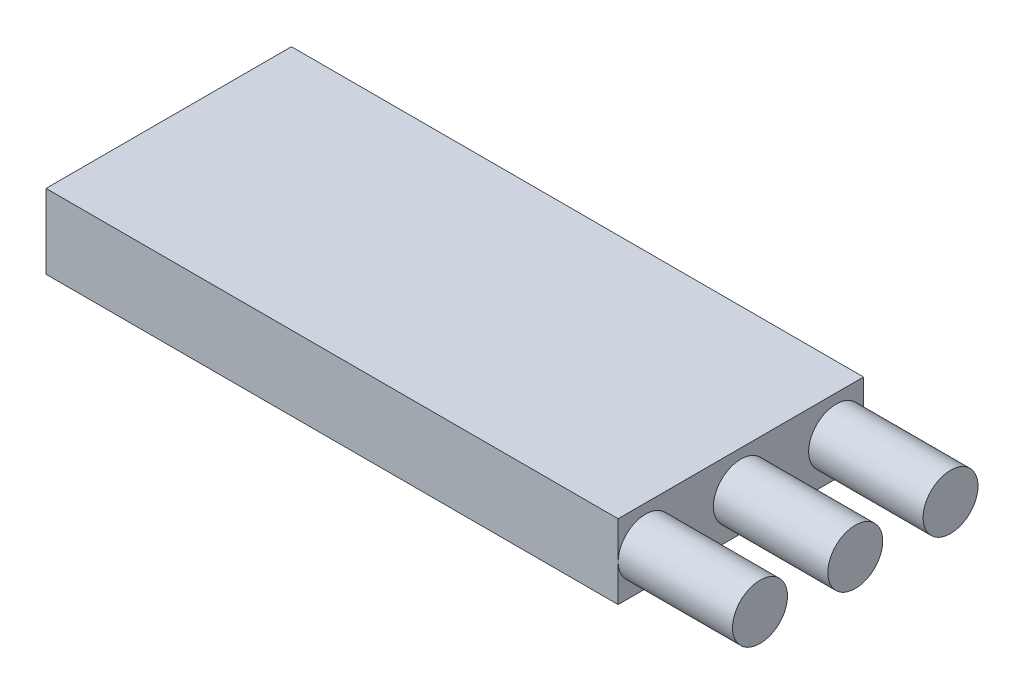
ISO-10303-21;
HEADER;
FILE_DESCRIPTION(('STEP AP214'),'2;1');
FILE_NAME('part.step','',(''),(''),'','','');
FILE_SCHEMA(('AUTOMOTIVE_DESIGN { 1 0 10303 214 1 1 1 1 }'));
ENDSEC;
DATA;
#1=APPLICATION_CONTEXT('core data for automotive mechanical design processes');
#2=APPLICATION_PROTOCOL_DEFINITION('international standard','automotive_design',2000,#1);
#3=PRODUCT_CONTEXT('',#1,'mechanical');
#4=PRODUCT('Part','Part','',(#3));
#5=PRODUCT_RELATED_PRODUCT_CATEGORY('part','',(#4));
#6=PRODUCT_DEFINITION_FORMATION('','',#4);
#7=PRODUCT_DEFINITION_CONTEXT('part definition',#1,'design');
#8=PRODUCT_DEFINITION('design','',#6,#7);
#9=PRODUCT_DEFINITION_SHAPE('','',#8);
#10=(LENGTH_UNIT() NAMED_UNIT(*) SI_UNIT(.MILLI.,.METRE.));
#11=(NAMED_UNIT(*) PLANE_ANGLE_UNIT() SI_UNIT($,.RADIAN.));
#12=(NAMED_UNIT(*) SI_UNIT($,.STERADIAN.) SOLID_ANGLE_UNIT());
#13=UNCERTAINTY_MEASURE_WITH_UNIT(LENGTH_MEASURE(1.E-05),#10,'distance_accuracy_value','');
#14=(GEOMETRIC_REPRESENTATION_CONTEXT(3) GLOBAL_UNCERTAINTY_ASSIGNED_CONTEXT((#13)) GLOBAL_UNIT_ASSIGNED_CONTEXT((#10,
#11,#12)) REPRESENTATION_CONTEXT('',''));
#15=CARTESIAN_POINT('',(0.,0.,0.));
#16=DIRECTION('',(0.,0.,1.));
#17=DIRECTION('',(1.,0.,0.));
#18=AXIS2_PLACEMENT_3D('',#15,#16,#17);
#19=CARTESIAN_POINT('',(0.,6.5,0.));
#20=DIRECTION('',(1.,0.,0.));
#21=DIRECTION('',(0.,0.,-1.));
#22=AXIS2_PLACEMENT_3D('',#19,#20,#21);
#23=PLANE('',#22);
#24=DIRECTION('',(0.,0.,1.));
#25=VECTOR('',#24,1.);
#26=CARTESIAN_POINT('',(0.,0.,0.));
#27=LINE('',#26,#25);
#28=CARTESIAN_POINT('',(0.,0.,-21.45));
#29=VERTEX_POINT('',#28);
#30=CARTESIAN_POINT('',(0.,0.,0.));
#31=VERTEX_POINT('',#30);
#32=EDGE_CURVE('E116',#29,#31,#27,.T.);
#33=ORIENTED_EDGE('',*,*,#32,.T.);
#34=DIRECTION('',(0.,-1.,0.));
#35=VECTOR('',#34,1.);
#36=CARTESIAN_POINT('',(0.,6.5,0.));
#37=LINE('',#36,#35);
#38=CARTESIAN_POINT('',(0.,6.5,0.));
#39=VERTEX_POINT('',#38);
#40=EDGE_CURVE('E39',#39,#31,#37,.T.);
#41=ORIENTED_EDGE('',*,*,#40,.F.);
#42=DIRECTION('',(0.,0.,1.));
#43=VECTOR('',#42,1.);
#44=CARTESIAN_POINT('',(0.,6.5,0.));
#45=LINE('',#44,#43);
#46=CARTESIAN_POINT('',(0.,6.5,-21.45));
#47=VERTEX_POINT('',#46);
#48=EDGE_CURVE('E120',#47,#39,#45,.T.);
#49=ORIENTED_EDGE('',*,*,#48,.F.);
#50=DIRECTION('',(0.,-1.,0.));
#51=VECTOR('',#50,1.);
#52=CARTESIAN_POINT('',(0.,6.5,-21.45));
#53=LINE('',#52,#51);
#54=EDGE_CURVE('E101',#47,#29,#53,.T.);
#55=ORIENTED_EDGE('',*,*,#54,.T.);
#56=EDGE_LOOP('',(#33,#41,#49,#55));
#57=FACE_BOUND('',#56,.T.);
#58=ADVANCED_FACE('F36',(#57),#23,.F.);
#59=CARTESIAN_POINT('',(0.,6.5,0.));
#60=DIRECTION('',(0.,0.,-1.));
#61=DIRECTION('',(-1.,0.,0.));
#62=AXIS2_PLACEMENT_3D('',#59,#60,#61);
#63=PLANE('',#62);
#64=DIRECTION('',(1.,0.,0.));
#65=VECTOR('',#64,1.);
#66=CARTESIAN_POINT('',(0.,0.,0.));
#67=LINE('',#66,#65);
#68=CARTESIAN_POINT('',(50.,0.,0.));
#69=VERTEX_POINT('',#68);
#70=EDGE_CURVE('E110',#31,#69,#67,.T.);
#71=ORIENTED_EDGE('',*,*,#70,.T.);
#72=DIRECTION('',(0.,-1.,0.));
#73=VECTOR('',#72,1.);
#74=CARTESIAN_POINT('',(50.,6.5,0.));
#75=LINE('',#74,#73);
#76=CARTESIAN_POINT('',(50.,3.25,0.));
#77=VERTEX_POINT('',#76);
#78=EDGE_CURVE('E94',#77,#69,#75,.T.);
#79=ORIENTED_EDGE('',*,*,#78,.F.);
#80=CARTESIAN_POINT('',(50.,6.5,0.));
#81=VERTEX_POINT('',#80);
#82=EDGE_CURVE('E104',#81,#77,#75,.T.);
#83=ORIENTED_EDGE('',*,*,#82,.F.);
#84=DIRECTION('',(1.,0.,0.));
#85=VECTOR('',#84,1.);
#86=CARTESIAN_POINT('',(0.,6.5,0.));
#87=LINE('',#86,#85);
#88=EDGE_CURVE('E83',#39,#81,#87,.T.);
#89=ORIENTED_EDGE('',*,*,#88,.F.);
#90=ORIENTED_EDGE('',*,*,#40,.T.);
#91=EDGE_LOOP('',(#71,#79,#83,#89,#90));
#92=FACE_BOUND('',#91,.T.);
#93=ADVANCED_FACE('F111',(#92),#63,.F.);
#94=CARTESIAN_POINT('',(50.,6.5,0.));
#95=DIRECTION('',(-1.,0.,0.));
#96=DIRECTION('',(0.,0.,1.));
#97=AXIS2_PLACEMENT_3D('',#94,#95,#96);
#98=PLANE('',#97);
#99=CARTESIAN_POINT('',(50.,3.25,-10.725));
#100=DIRECTION('',(1.,0.,0.));
#101=DIRECTION('',(0.,0.,-1.));
#102=AXIS2_PLACEMENT_3D('',#99,#100,#101);
#103=CIRCLE('',#102,2.4);
#104=CARTESIAN_POINT('',(50.,3.25,-13.125));
#105=VERTEX_POINT('',#104);
#106=EDGE_CURVE('E11',#105,#105,#103,.T.);
#107=ORIENTED_EDGE('',*,*,#106,.F.);
#108=EDGE_LOOP('',(#107));
#109=FACE_BOUND('',#108,.T.);
#110=DIRECTION('',(0.,-1.,0.));
#111=VECTOR('',#110,1.);
#112=CARTESIAN_POINT('',(50.,6.5,-21.45));
#113=LINE('',#112,#111);
#114=CARTESIAN_POINT('',(50.,3.25,-21.45));
#115=VERTEX_POINT('',#114);
#116=CARTESIAN_POINT('',(50.,0.,-21.45));
#117=VERTEX_POINT('',#116);
#118=EDGE_CURVE('E71',#115,#117,#113,.T.);
#119=ORIENTED_EDGE('',*,*,#118,.F.);
#120=CARTESIAN_POINT('',(50.,3.25,-19.05));
#121=DIRECTION('',(1.,0.,0.));
#122=DIRECTION('',(0.,0.,-1.));
#123=AXIS2_PLACEMENT_3D('',#120,#121,#122);
#124=CIRCLE('',#123,2.4);
#125=EDGE_CURVE('E98',#115,#115,#124,.T.);
#126=ORIENTED_EDGE('',*,*,#125,.F.);
#127=CARTESIAN_POINT('',(50.,6.5,-21.45));
#128=VERTEX_POINT('',#127);
#129=EDGE_CURVE('E89',#128,#115,#113,.T.);
#130=ORIENTED_EDGE('',*,*,#129,.F.);
#131=DIRECTION('',(0.,0.,-1.));
#132=VECTOR('',#131,1.);
#133=CARTESIAN_POINT('',(50.,6.5,0.));
#134=LINE('',#133,#132);
#135=EDGE_CURVE('E125',#81,#128,#134,.T.);
#136=ORIENTED_EDGE('',*,*,#135,.F.);
#137=ORIENTED_EDGE('',*,*,#82,.T.);
#138=CARTESIAN_POINT('',(50.,3.25,-2.4));
#139=DIRECTION('',(1.,0.,0.));
#140=DIRECTION('',(0.,0.,-1.));
#141=AXIS2_PLACEMENT_3D('',#138,#139,#140);
#142=CIRCLE('',#141,2.4);
#143=EDGE_CURVE('E109',#77,#77,#142,.T.);
#144=ORIENTED_EDGE('',*,*,#143,.F.);
#145=ORIENTED_EDGE('',*,*,#78,.T.);
#146=DIRECTION('',(0.,0.,-1.));
#147=VECTOR('',#146,1.);
#148=CARTESIAN_POINT('',(50.,0.,0.));
#149=LINE('',#148,#147);
#150=EDGE_CURVE('E100',#69,#117,#149,.T.);
#151=ORIENTED_EDGE('',*,*,#150,.T.);
#152=EDGE_LOOP('',(#119,#126,#130,#136,#137,#144,#145,#151));
#153=FACE_BOUND('',#152,.T.);
#154=ADVANCED_FACE('F96',(#109,#153),#98,.F.);
#155=CARTESIAN_POINT('',(0.,6.5,-21.45));
#156=DIRECTION('',(0.,0.,1.));
#157=DIRECTION('',(1.,0.,0.));
#158=AXIS2_PLACEMENT_3D('',#155,#156,#157);
#159=PLANE('',#158);
#160=DIRECTION('',(-1.,0.,0.));
#161=VECTOR('',#160,1.);
#162=CARTESIAN_POINT('',(0.,0.,-21.45));
#163=LINE('',#162,#161);
#164=EDGE_CURVE('E75',#117,#29,#163,.T.);
#165=ORIENTED_EDGE('',*,*,#164,.T.);
#166=ORIENTED_EDGE('',*,*,#54,.F.);
#167=DIRECTION('',(-1.,0.,0.));
#168=VECTOR('',#167,1.);
#169=CARTESIAN_POINT('',(0.,6.5,-21.45));
#170=LINE('',#169,#168);
#171=EDGE_CURVE('E53',#128,#47,#170,.T.);
#172=ORIENTED_EDGE('',*,*,#171,.F.);
#173=ORIENTED_EDGE('',*,*,#129,.T.);
#174=ORIENTED_EDGE('',*,*,#118,.T.);
#175=EDGE_LOOP('',(#165,#166,#172,#173,#174));
#176=FACE_BOUND('',#175,.T.);
#177=ADVANCED_FACE('F90',(#176),#159,.F.);
#178=CARTESIAN_POINT('',(0.,6.5,0.));
#179=DIRECTION('',(0.,-1.,0.));
#180=DIRECTION('',(0.,0.,-1.));
#181=AXIS2_PLACEMENT_3D('',#178,#179,#180);
#182=PLANE('',#181);
#183=ORIENTED_EDGE('',*,*,#48,.T.);
#184=ORIENTED_EDGE('',*,*,#88,.T.);
#185=ORIENTED_EDGE('',*,*,#135,.T.);
#186=ORIENTED_EDGE('',*,*,#171,.T.);
#187=EDGE_LOOP('',(#183,#184,#185,#186));
#188=FACE_BOUND('',#187,.T.);
#189=ADVANCED_FACE('F161',(#188),#182,.F.);
#190=CARTESIAN_POINT('',(0.,0.,0.));
#191=DIRECTION('',(0.,-1.,0.));
#192=DIRECTION('',(0.,0.,-1.));
#193=AXIS2_PLACEMENT_3D('',#190,#191,#192);
#194=PLANE('',#193);
#195=ORIENTED_EDGE('',*,*,#32,.F.);
#196=ORIENTED_EDGE('',*,*,#164,.F.);
#197=ORIENTED_EDGE('',*,*,#150,.F.);
#198=ORIENTED_EDGE('',*,*,#70,.F.);
#199=EDGE_LOOP('',(#195,#196,#197,#198));
#200=FACE_BOUND('',#199,.T.);
#201=ADVANCED_FACE('F118',(#200),#194,.T.);
#202=CARTESIAN_POINT('',(60.,3.25,-10.725));
#203=DIRECTION('',(-1.,0.,0.));
#204=DIRECTION('',(0.,0.,1.));
#205=AXIS2_PLACEMENT_3D('',#202,#203,#204);
#206=CYLINDRICAL_SURFACE('',#205,2.4);
#207=CARTESIAN_POINT('',(60.,3.25,-10.725));
#208=DIRECTION('',(1.,0.,0.));
#209=DIRECTION('',(0.,0.,-1.));
#210=AXIS2_PLACEMENT_3D('',#207,#208,#209);
#211=CIRCLE('',#210,2.4);
#212=CARTESIAN_POINT('',(60.,3.25,-13.125));
#213=VERTEX_POINT('',#212);
#214=EDGE_CURVE('E123',#213,#213,#211,.T.);
#215=ORIENTED_EDGE('',*,*,#214,.F.);
#216=EDGE_LOOP('',(#215));
#217=FACE_BOUND('',#216,.T.);
#218=ORIENTED_EDGE('',*,*,#106,.T.);
#219=EDGE_LOOP('',(#218));
#220=FACE_BOUND('',#219,.T.);
#221=ADVANCED_FACE('F168',(#217,#220),#206,.T.);
#222=CARTESIAN_POINT('',(60.,3.25,-10.725));
#223=DIRECTION('',(1.,0.,0.));
#224=DIRECTION('',(0.,0.,-1.));
#225=AXIS2_PLACEMENT_3D('',#222,#223,#224);
#226=PLANE('',#225);
#227=ORIENTED_EDGE('',*,*,#214,.T.);
#228=EDGE_LOOP('',(#227));
#229=FACE_BOUND('',#228,.T.);
#230=ADVANCED_FACE('F181',(#229),#226,.T.);
#231=CARTESIAN_POINT('',(60.,3.25,-2.4));
#232=DIRECTION('',(-1.,0.,0.));
#233=DIRECTION('',(0.,0.,1.));
#234=AXIS2_PLACEMENT_3D('',#231,#232,#233);
#235=CYLINDRICAL_SURFACE('',#234,2.4);
#236=CARTESIAN_POINT('',(60.,3.25,-2.4));
#237=DIRECTION('',(1.,0.,0.));
#238=DIRECTION('',(0.,0.,-1.));
#239=AXIS2_PLACEMENT_3D('',#236,#237,#238);
#240=CIRCLE('',#239,2.4);
#241=CARTESIAN_POINT('',(60.,3.25,-4.8));
#242=VERTEX_POINT('',#241);
#243=EDGE_CURVE('E131',#242,#242,#240,.T.);
#244=ORIENTED_EDGE('',*,*,#243,.F.);
#245=EDGE_LOOP('',(#244));
#246=FACE_BOUND('',#245,.T.);
#247=ORIENTED_EDGE('',*,*,#143,.T.);
#248=EDGE_LOOP('',(#247));
#249=FACE_BOUND('',#248,.T.);
#250=ADVANCED_FACE('F152',(#246,#249),#235,.T.);
#251=CARTESIAN_POINT('',(60.,3.25,-2.4));
#252=DIRECTION('',(1.,0.,0.));
#253=DIRECTION('',(0.,0.,-1.));
#254=AXIS2_PLACEMENT_3D('',#251,#252,#253);
#255=PLANE('',#254);
#256=ORIENTED_EDGE('',*,*,#243,.T.);
#257=EDGE_LOOP('',(#256));
#258=FACE_BOUND('',#257,.T.);
#259=ADVANCED_FACE('F145',(#258),#255,.T.);
#260=CARTESIAN_POINT('',(60.,3.25,-19.05));
#261=DIRECTION('',(-1.,0.,0.));
#262=DIRECTION('',(0.,0.,1.));
#263=AXIS2_PLACEMENT_3D('',#260,#261,#262);
#264=CYLINDRICAL_SURFACE('',#263,2.4);
#265=CARTESIAN_POINT('',(60.,3.25,-19.05));
#266=DIRECTION('',(1.,0.,0.));
#267=DIRECTION('',(0.,0.,-1.));
#268=AXIS2_PLACEMENT_3D('',#265,#266,#267);
#269=CIRCLE('',#268,2.4);
#270=CARTESIAN_POINT('',(60.,3.25,-21.45));
#271=VERTEX_POINT('',#270);
#272=EDGE_CURVE('E133',#271,#271,#269,.T.);
#273=ORIENTED_EDGE('',*,*,#272,.F.);
#274=EDGE_LOOP('',(#273));
#275=FACE_BOUND('',#274,.T.);
#276=ORIENTED_EDGE('',*,*,#125,.T.);
#277=EDGE_LOOP('',(#276));
#278=FACE_BOUND('',#277,.T.);
#279=ADVANCED_FACE('F142',(#275,#278),#264,.T.);
#280=CARTESIAN_POINT('',(60.,3.25,-19.05));
#281=DIRECTION('',(1.,0.,0.));
#282=DIRECTION('',(0.,0.,-1.));
#283=AXIS2_PLACEMENT_3D('',#280,#281,#282);
#284=PLANE('',#283);
#285=ORIENTED_EDGE('',*,*,#272,.T.);
#286=EDGE_LOOP('',(#285));
#287=FACE_BOUND('',#286,.T.);
#288=ADVANCED_FACE('F140',(#287),#284,.T.);
#289=CLOSED_SHELL('',(#58,#93,#154,#177,#189,#201,#221,#230,#250,#259,#279,#288));
#290=MANIFOLD_SOLID_BREP('B2',#289);
#291=ADVANCED_BREP_SHAPE_REPRESENTATION('',(#18,#290),#14);
#292=SHAPE_DEFINITION_REPRESENTATION(#9,#291);
ENDSEC;
END-ISO-10303-21;
